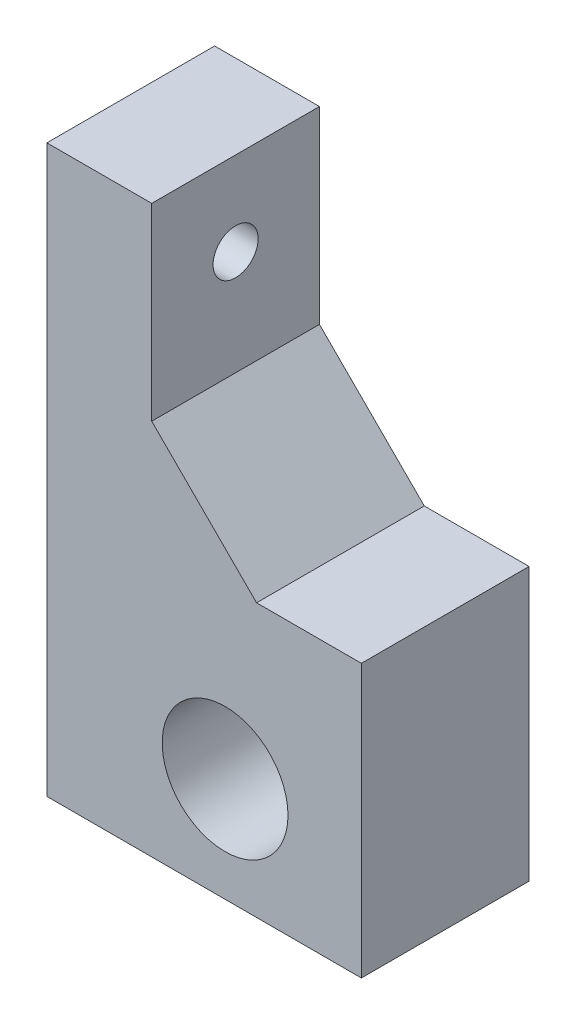
ISO-10303-21;
HEADER;
FILE_DESCRIPTION(('STEP AP214'),'2;1');
FILE_NAME('part.step','',(''),(''),'','','');
FILE_SCHEMA(('AUTOMOTIVE_DESIGN { 1 0 10303 214 1 1 1 1 }'));
ENDSEC;
DATA;
#1=APPLICATION_CONTEXT('core data for automotive mechanical design processes');
#2=APPLICATION_PROTOCOL_DEFINITION('international standard','automotive_design',2000,#1);
#3=PRODUCT_CONTEXT('',#1,'mechanical');
#4=PRODUCT('Part','Part','',(#3));
#5=PRODUCT_RELATED_PRODUCT_CATEGORY('part','',(#4));
#6=PRODUCT_DEFINITION_FORMATION('','',#4);
#7=PRODUCT_DEFINITION_CONTEXT('part definition',#1,'design');
#8=PRODUCT_DEFINITION('design','',#6,#7);
#9=PRODUCT_DEFINITION_SHAPE('','',#8);
#10=(LENGTH_UNIT() NAMED_UNIT(*) SI_UNIT(.MILLI.,.METRE.));
#11=(NAMED_UNIT(*) PLANE_ANGLE_UNIT() SI_UNIT($,.RADIAN.));
#12=(NAMED_UNIT(*) SI_UNIT($,.STERADIAN.) SOLID_ANGLE_UNIT());
#13=UNCERTAINTY_MEASURE_WITH_UNIT(LENGTH_MEASURE(1.E-05),#10,'distance_accuracy_value','');
#14=(GEOMETRIC_REPRESENTATION_CONTEXT(3) GLOBAL_UNCERTAINTY_ASSIGNED_CONTEXT((#13)) GLOBAL_UNIT_ASSIGNED_CONTEXT((#10,
#11,#12)) REPRESENTATION_CONTEXT('',''));
#15=CARTESIAN_POINT('',(0.,0.,0.));
#16=DIRECTION('',(0.,0.,1.));
#17=DIRECTION('',(1.,0.,0.));
#18=AXIS2_PLACEMENT_3D('',#15,#16,#17);
#19=CARTESIAN_POINT('',(10.,0.,0.));
#20=DIRECTION('',(-1.,0.,0.));
#21=DIRECTION('',(0.,0.,1.));
#22=AXIS2_PLACEMENT_3D('',#19,#20,#21);
#23=PLANE('',#22);
#24=DIRECTION('',(0.,-1.,0.));
#25=VECTOR('',#24,1.);
#26=CARTESIAN_POINT('',(10.,0.,0.));
#27=LINE('',#26,#25);
#28=CARTESIAN_POINT('',(10.,48.,0.));
#29=VERTEX_POINT('',#28);
#30=CARTESIAN_POINT('',(10.,30.,0.));
#31=VERTEX_POINT('',#30);
#32=EDGE_CURVE('E151',#29,#31,#27,.T.);
#33=ORIENTED_EDGE('',*,*,#32,.T.);
#34=DIRECTION('',(0.,0.,-1.));
#35=VECTOR('',#34,1.);
#36=CARTESIAN_POINT('',(10.,30.,0.));
#37=LINE('',#36,#35);
#38=CARTESIAN_POINT('',(10.,30.,-16.));
#39=VERTEX_POINT('',#38);
#40=EDGE_CURVE('E54',#31,#39,#37,.T.);
#41=ORIENTED_EDGE('',*,*,#40,.T.);
#42=DIRECTION('',(0.,1.,0.));
#43=VECTOR('',#42,1.);
#44=CARTESIAN_POINT('',(10.,0.,-16.));
#45=LINE('',#44,#43);
#46=CARTESIAN_POINT('',(10.,48.,-16.));
#47=VERTEX_POINT('',#46);
#48=EDGE_CURVE('E153',#39,#47,#45,.T.);
#49=ORIENTED_EDGE('',*,*,#48,.T.);
#50=DIRECTION('',(0.,0.,1.));
#51=VECTOR('',#50,1.);
#52=CARTESIAN_POINT('',(10.,48.,0.));
#53=LINE('',#52,#51);
#54=EDGE_CURVE('E156',#47,#29,#53,.T.);
#55=ORIENTED_EDGE('',*,*,#54,.T.);
#56=EDGE_LOOP('',(#33,#41,#49,#55));
#57=FACE_BOUND('',#56,.T.);
#58=CARTESIAN_POINT('',(10.,40.,-8.));
#59=DIRECTION('',(1.,0.,0.));
#60=DIRECTION('',(0.,0.,-1.));
#61=AXIS2_PLACEMENT_3D('',#58,#59,#60);
#62=CIRCLE('',#61,2.15);
#63=CARTESIAN_POINT('',(10.,40.,-10.15));
#64=VERTEX_POINT('',#63);
#65=EDGE_CURVE('E145',#64,#64,#62,.T.);
#66=ORIENTED_EDGE('',*,*,#65,.F.);
#67=EDGE_LOOP('',(#66));
#68=FACE_BOUND('',#67,.T.);
#69=ADVANCED_FACE('F39',(#57,#68),#23,.F.);
#70=CARTESIAN_POINT('',(0.,0.,0.));
#71=DIRECTION('',(-1.,0.,0.));
#72=DIRECTION('',(0.,0.,1.));
#73=AXIS2_PLACEMENT_3D('',#70,#71,#72);
#74=PLANE('',#73);
#75=CARTESIAN_POINT('',(0.,40.,-8.));
#76=DIRECTION('',(1.,0.,0.));
#77=DIRECTION('',(0.,0.,-1.));
#78=AXIS2_PLACEMENT_3D('',#75,#76,#77);
#79=CIRCLE('',#78,2.15);
#80=CARTESIAN_POINT('',(0.,40.,-10.15));
#81=VERTEX_POINT('',#80);
#82=EDGE_CURVE('E144',#81,#81,#79,.T.);
#83=ORIENTED_EDGE('',*,*,#82,.T.);
#84=EDGE_LOOP('',(#83));
#85=FACE_BOUND('',#84,.T.);
#86=DIRECTION('',(0.,-1.,0.));
#87=VECTOR('',#86,1.);
#88=CARTESIAN_POINT('',(0.,0.,0.));
#89=LINE('',#88,#87);
#90=CARTESIAN_POINT('',(0.,48.,0.));
#91=VERTEX_POINT('',#90);
#92=CARTESIAN_POINT('',(0.,-6.,0.));
#93=VERTEX_POINT('',#92);
#94=EDGE_CURVE('E148',#91,#93,#89,.T.);
#95=ORIENTED_EDGE('',*,*,#94,.F.);
#96=DIRECTION('',(0.,0.,1.));
#97=VECTOR('',#96,1.);
#98=CARTESIAN_POINT('',(0.,48.,0.));
#99=LINE('',#98,#97);
#100=CARTESIAN_POINT('',(0.,48.,-16.));
#101=VERTEX_POINT('',#100);
#102=EDGE_CURVE('E154',#101,#91,#99,.T.);
#103=ORIENTED_EDGE('',*,*,#102,.F.);
#104=DIRECTION('',(0.,1.,0.));
#105=VECTOR('',#104,1.);
#106=CARTESIAN_POINT('',(0.,0.,-16.));
#107=LINE('',#106,#105);
#108=CARTESIAN_POINT('',(0.,-6.,-16.));
#109=VERTEX_POINT('',#108);
#110=EDGE_CURVE('E160',#109,#101,#107,.T.);
#111=ORIENTED_EDGE('',*,*,#110,.F.);
#112=DIRECTION('',(0.,0.,1.));
#113=VECTOR('',#112,1.);
#114=CARTESIAN_POINT('',(0.,-6.,-16.));
#115=LINE('',#114,#113);
#116=EDGE_CURVE('E122',#109,#93,#115,.T.);
#117=ORIENTED_EDGE('',*,*,#116,.T.);
#118=EDGE_LOOP('',(#95,#103,#111,#117));
#119=FACE_BOUND('',#118,.T.);
#120=CARTESIAN_POINT('',(0.,8.00000000000001,-8.));
#121=DIRECTION('',(1.,0.,0.));
#122=DIRECTION('',(0.,0.,-1.));
#123=AXIS2_PLACEMENT_3D('',#120,#121,#122);
#124=CIRCLE('',#123,1.75);
#125=CARTESIAN_POINT('',(0.,8.00000000000001,-9.75));
#126=VERTEX_POINT('',#125);
#127=EDGE_CURVE('E141',#126,#126,#124,.T.);
#128=ORIENTED_EDGE('',*,*,#127,.T.);
#129=EDGE_LOOP('',(#128));
#130=FACE_BOUND('',#129,.T.);
#131=ADVANCED_FACE('F183',(#85,#119,#130),#74,.T.);
#132=CARTESIAN_POINT('',(10.,0.,0.));
#133=DIRECTION('',(0.,0.,-1.));
#134=DIRECTION('',(-1.,0.,0.));
#135=AXIS2_PLACEMENT_3D('',#132,#133,#134);
#136=PLANE('',#135);
#137=DIRECTION('',(-1.,0.,0.));
#138=VECTOR('',#137,1.);
#139=CARTESIAN_POINT('',(0.,20.,0.));
#140=LINE('',#139,#138);
#141=CARTESIAN_POINT('',(30.,20.,0.));
#142=VERTEX_POINT('',#141);
#143=CARTESIAN_POINT('',(20.0000000000001,20.,0.));
#144=VERTEX_POINT('',#143);
#145=EDGE_CURVE('E126',#142,#144,#140,.T.);
#146=ORIENTED_EDGE('',*,*,#145,.T.);
#147=DIRECTION('',(-0.707106781186551,0.707106781186544,0.));
#148=VECTOR('',#147,1.);
#149=CARTESIAN_POINT('',(25.,15.0000000000001,0.));
#150=LINE('',#149,#148);
#151=EDGE_CURVE('E47',#144,#31,#150,.T.);
#152=ORIENTED_EDGE('',*,*,#151,.T.);
#153=ORIENTED_EDGE('',*,*,#32,.F.);
#154=DIRECTION('',(-1.,0.,0.));
#155=VECTOR('',#154,1.);
#156=CARTESIAN_POINT('',(10.,48.,0.));
#157=LINE('',#156,#155);
#158=EDGE_CURVE('E158',#29,#91,#157,.T.);
#159=ORIENTED_EDGE('',*,*,#158,.T.);
#160=ORIENTED_EDGE('',*,*,#94,.T.);
#161=DIRECTION('',(1.,0.,0.));
#162=VECTOR('',#161,1.);
#163=CARTESIAN_POINT('',(0.,-6.,0.));
#164=LINE('',#163,#162);
#165=CARTESIAN_POINT('',(30.,-6.,0.));
#166=VERTEX_POINT('',#165);
#167=EDGE_CURVE('E132',#93,#166,#164,.T.);
#168=ORIENTED_EDGE('',*,*,#167,.T.);
#169=DIRECTION('',(0.,1.,0.));
#170=VECTOR('',#169,1.);
#171=CARTESIAN_POINT('',(30.,0.,0.));
#172=LINE('',#171,#170);
#173=EDGE_CURVE('E102',#166,#142,#172,.T.);
#174=ORIENTED_EDGE('',*,*,#173,.T.);
#175=EDGE_LOOP('',(#146,#152,#153,#159,#160,#168,#174));
#176=FACE_BOUND('',#175,.T.);
#177=CARTESIAN_POINT('',(17.,3.93640107200004,0.));
#178=DIRECTION('',(0.,0.,1.));
#179=DIRECTION('',(1.,0.,0.));
#180=AXIS2_PLACEMENT_3D('',#177,#178,#179);
#181=CIRCLE('',#180,6.);
#182=CARTESIAN_POINT('',(23.,3.93640107200004,0.));
#183=VERTEX_POINT('',#182);
#184=EDGE_CURVE('E123',#183,#183,#181,.T.);
#185=ORIENTED_EDGE('',*,*,#184,.F.);
#186=EDGE_LOOP('',(#185));
#187=FACE_BOUND('',#186,.T.);
#188=ADVANCED_FACE('F177',(#176,#187),#136,.F.);
#189=CARTESIAN_POINT('',(10.,0.,-16.));
#190=DIRECTION('',(0.,0.,1.));
#191=DIRECTION('',(0.,-1.,0.));
#192=AXIS2_PLACEMENT_3D('',#189,#190,#191);
#193=PLANE('',#192);
#194=DIRECTION('',(1.,0.,0.));
#195=VECTOR('',#194,1.);
#196=CARTESIAN_POINT('',(0.,-6.,-16.));
#197=LINE('',#196,#195);
#198=CARTESIAN_POINT('',(30.,-6.,-16.));
#199=VERTEX_POINT('',#198);
#200=EDGE_CURVE('E115',#109,#199,#197,.T.);
#201=ORIENTED_EDGE('',*,*,#200,.F.);
#202=ORIENTED_EDGE('',*,*,#110,.T.);
#203=DIRECTION('',(-1.,0.,0.));
#204=VECTOR('',#203,1.);
#205=CARTESIAN_POINT('',(10.,48.,-16.));
#206=LINE('',#205,#204);
#207=EDGE_CURVE('E165',#47,#101,#206,.T.);
#208=ORIENTED_EDGE('',*,*,#207,.F.);
#209=ORIENTED_EDGE('',*,*,#48,.F.);
#210=DIRECTION('',(0.707106781186551,-0.707106781186544,0.));
#211=VECTOR('',#210,1.);
#212=CARTESIAN_POINT('',(25.,15.0000000000001,-16.));
#213=LINE('',#212,#211);
#214=CARTESIAN_POINT('',(20.0000000000001,20.,-16.));
#215=VERTEX_POINT('',#214);
#216=EDGE_CURVE('E11',#39,#215,#213,.T.);
#217=ORIENTED_EDGE('',*,*,#216,.T.);
#218=DIRECTION('',(-1.,0.,0.));
#219=VECTOR('',#218,1.);
#220=CARTESIAN_POINT('',(0.,20.,-16.));
#221=LINE('',#220,#219);
#222=CARTESIAN_POINT('',(30.,20.,-16.));
#223=VERTEX_POINT('',#222);
#224=EDGE_CURVE('E117',#223,#215,#221,.T.);
#225=ORIENTED_EDGE('',*,*,#224,.F.);
#226=DIRECTION('',(0.,1.,0.));
#227=VECTOR('',#226,1.);
#228=CARTESIAN_POINT('',(30.,0.,-16.));
#229=LINE('',#228,#227);
#230=EDGE_CURVE('E100',#199,#223,#229,.T.);
#231=ORIENTED_EDGE('',*,*,#230,.F.);
#232=EDGE_LOOP('',(#201,#202,#208,#209,#217,#225,#231));
#233=FACE_BOUND('',#232,.T.);
#234=CARTESIAN_POINT('',(17.,3.93640107200004,-16.));
#235=DIRECTION('',(0.,0.,1.));
#236=DIRECTION('',(1.,0.,0.));
#237=AXIS2_PLACEMENT_3D('',#234,#235,#236);
#238=CIRCLE('',#237,6.);
#239=CARTESIAN_POINT('',(23.,3.93640107200004,-16.));
#240=VERTEX_POINT('',#239);
#241=EDGE_CURVE('E108',#240,#240,#238,.T.);
#242=ORIENTED_EDGE('',*,*,#241,.T.);
#243=EDGE_LOOP('',(#242));
#244=FACE_BOUND('',#243,.T.);
#245=ADVANCED_FACE('F113',(#233,#244),#193,.F.);
#246=CARTESIAN_POINT('',(10.,48.,0.));
#247=DIRECTION('',(0.,-1.,0.));
#248=DIRECTION('',(0.,0.,-1.));
#249=AXIS2_PLACEMENT_3D('',#246,#247,#248);
#250=PLANE('',#249);
#251=ORIENTED_EDGE('',*,*,#102,.T.);
#252=ORIENTED_EDGE('',*,*,#158,.F.);
#253=ORIENTED_EDGE('',*,*,#54,.F.);
#254=ORIENTED_EDGE('',*,*,#207,.T.);
#255=EDGE_LOOP('',(#251,#252,#253,#254));
#256=FACE_BOUND('',#255,.T.);
#257=ADVANCED_FACE('F188',(#256),#250,.F.);
#258=CARTESIAN_POINT('',(10.,40.,-8.));
#259=DIRECTION('',(-1.,0.,0.));
#260=DIRECTION('',(0.,0.,1.));
#261=AXIS2_PLACEMENT_3D('',#258,#259,#260);
#262=CYLINDRICAL_SURFACE('',#261,2.15);
#263=ORIENTED_EDGE('',*,*,#65,.T.);
#264=EDGE_LOOP('',(#263));
#265=FACE_BOUND('',#264,.T.);
#266=ORIENTED_EDGE('',*,*,#82,.F.);
#267=EDGE_LOOP('',(#266));
#268=FACE_BOUND('',#267,.T.);
#269=ADVANCED_FACE('F205',(#265,#268),#262,.F.);
#270=CARTESIAN_POINT('',(10.,8.00000000000001,-8.));
#271=DIRECTION('',(-1.,0.,0.));
#272=DIRECTION('',(0.,0.,1.));
#273=AXIS2_PLACEMENT_3D('',#270,#271,#272);
#274=CYLINDRICAL_SURFACE('',#273,1.75);
#275=CARTESIAN_POINT('',(10.,8.00000000000001,-8.));
#276=DIRECTION('',(1.,0.,0.));
#277=DIRECTION('',(0.,0.,-1.));
#278=AXIS2_PLACEMENT_3D('',#275,#276,#277);
#279=CIRCLE('',#278,1.75);
#280=CARTESIAN_POINT('',(10.,8.00000000000001,-9.75));
#281=VERTEX_POINT('',#280);
#282=EDGE_CURVE('E137',#281,#281,#279,.T.);
#283=ORIENTED_EDGE('',*,*,#282,.T.);
#284=EDGE_LOOP('',(#283));
#285=FACE_BOUND('',#284,.T.);
#286=ORIENTED_EDGE('',*,*,#127,.F.);
#287=EDGE_LOOP('',(#286));
#288=FACE_BOUND('',#287,.T.);
#289=ADVANCED_FACE('F231',(#285,#288),#274,.F.);
#290=CARTESIAN_POINT('',(10.,0.,-16.));
#291=DIRECTION('',(1.,0.,0.));
#292=DIRECTION('',(0.,0.,-1.));
#293=AXIS2_PLACEMENT_3D('',#290,#291,#292);
#294=PLANE('',#293);
#295=ORIENTED_EDGE('',*,*,#282,.F.);
#296=EDGE_LOOP('',(#295));
#297=FACE_BOUND('',#296,.T.);
#298=ADVANCED_FACE('F238',(#297),#294,.F.);
#299=CARTESIAN_POINT('',(0.,-6.,-16.));
#300=DIRECTION('',(0.,-1.,0.));
#301=DIRECTION('',(0.,0.,-1.));
#302=AXIS2_PLACEMENT_3D('',#299,#300,#301);
#303=PLANE('',#302);
#304=ORIENTED_EDGE('',*,*,#167,.F.);
#305=ORIENTED_EDGE('',*,*,#116,.F.);
#306=ORIENTED_EDGE('',*,*,#200,.T.);
#307=DIRECTION('',(0.,0.,1.));
#308=VECTOR('',#307,1.);
#309=CARTESIAN_POINT('',(30.,-6.,-16.));
#310=LINE('',#309,#308);
#311=EDGE_CURVE('E97',#199,#166,#310,.T.);
#312=ORIENTED_EDGE('',*,*,#311,.T.);
#313=EDGE_LOOP('',(#304,#305,#306,#312));
#314=FACE_BOUND('',#313,.T.);
#315=ADVANCED_FACE('F120',(#314),#303,.T.);
#316=CARTESIAN_POINT('',(0.,20.,-16.));
#317=DIRECTION('',(0.,1.,0.));
#318=DIRECTION('',(-1.,0.,0.));
#319=AXIS2_PLACEMENT_3D('',#316,#317,#318);
#320=PLANE('',#319);
#321=ORIENTED_EDGE('',*,*,#224,.T.);
#322=DIRECTION('',(0.,0.,1.));
#323=VECTOR('',#322,1.);
#324=CARTESIAN_POINT('',(20.0000000000001,20.,-16.));
#325=LINE('',#324,#323);
#326=EDGE_CURVE('E168',#215,#144,#325,.T.);
#327=ORIENTED_EDGE('',*,*,#326,.T.);
#328=ORIENTED_EDGE('',*,*,#145,.F.);
#329=DIRECTION('',(0.,0.,1.));
#330=VECTOR('',#329,1.);
#331=CARTESIAN_POINT('',(30.,20.,-16.));
#332=LINE('',#331,#330);
#333=EDGE_CURVE('E107',#223,#142,#332,.T.);
#334=ORIENTED_EDGE('',*,*,#333,.F.);
#335=EDGE_LOOP('',(#321,#327,#328,#334));
#336=FACE_BOUND('',#335,.T.);
#337=ADVANCED_FACE('F174',(#336),#320,.T.);
#338=CARTESIAN_POINT('',(30.,0.,-16.));
#339=DIRECTION('',(1.,0.,0.));
#340=DIRECTION('',(0.,0.,-1.));
#341=AXIS2_PLACEMENT_3D('',#338,#339,#340);
#342=PLANE('',#341);
#343=ORIENTED_EDGE('',*,*,#173,.F.);
#344=ORIENTED_EDGE('',*,*,#311,.F.);
#345=ORIENTED_EDGE('',*,*,#230,.T.);
#346=ORIENTED_EDGE('',*,*,#333,.T.);
#347=EDGE_LOOP('',(#343,#344,#345,#346));
#348=FACE_BOUND('',#347,.T.);
#349=ADVANCED_FACE('F99',(#348),#342,.T.);
#350=CARTESIAN_POINT('',(17.,3.93640107200004,-16.));
#351=DIRECTION('',(0.,0.,1.));
#352=DIRECTION('',(1.,0.,0.));
#353=AXIS2_PLACEMENT_3D('',#350,#351,#352);
#354=CYLINDRICAL_SURFACE('',#353,6.);
#355=ORIENTED_EDGE('',*,*,#241,.F.);
#356=EDGE_LOOP('',(#355));
#357=FACE_BOUND('',#356,.T.);
#358=ORIENTED_EDGE('',*,*,#184,.T.);
#359=EDGE_LOOP('',(#358));
#360=FACE_BOUND('',#359,.T.);
#361=ADVANCED_FACE('F191',(#357,#360),#354,.F.);
#362=CARTESIAN_POINT('',(20.0000000000001,20.,-16.));
#363=DIRECTION('',(-0.707106781186544,-0.707106781186551,0.));
#364=DIRECTION('',(0.,0.,1.));
#365=AXIS2_PLACEMENT_3D('',#362,#363,#364);
#366=PLANE('',#365);
#367=ORIENTED_EDGE('',*,*,#216,.F.);
#368=ORIENTED_EDGE('',*,*,#40,.F.);
#369=ORIENTED_EDGE('',*,*,#151,.F.);
#370=ORIENTED_EDGE('',*,*,#326,.F.);
#371=EDGE_LOOP('',(#367,#368,#369,#370));
#372=FACE_BOUND('',#371,.T.);
#373=ADVANCED_FACE('F41',(#372),#366,.F.);
#374=CLOSED_SHELL('',(#69,#131,#188,#245,#257,#269,#289,#298,#315,#337,#349,#361,#373));
#375=MANIFOLD_SOLID_BREP('B2',#374);
#376=ADVANCED_BREP_SHAPE_REPRESENTATION('',(#18,#375),#14);
#377=SHAPE_DEFINITION_REPRESENTATION(#9,#376);
ENDSEC;
END-ISO-10303-21;
